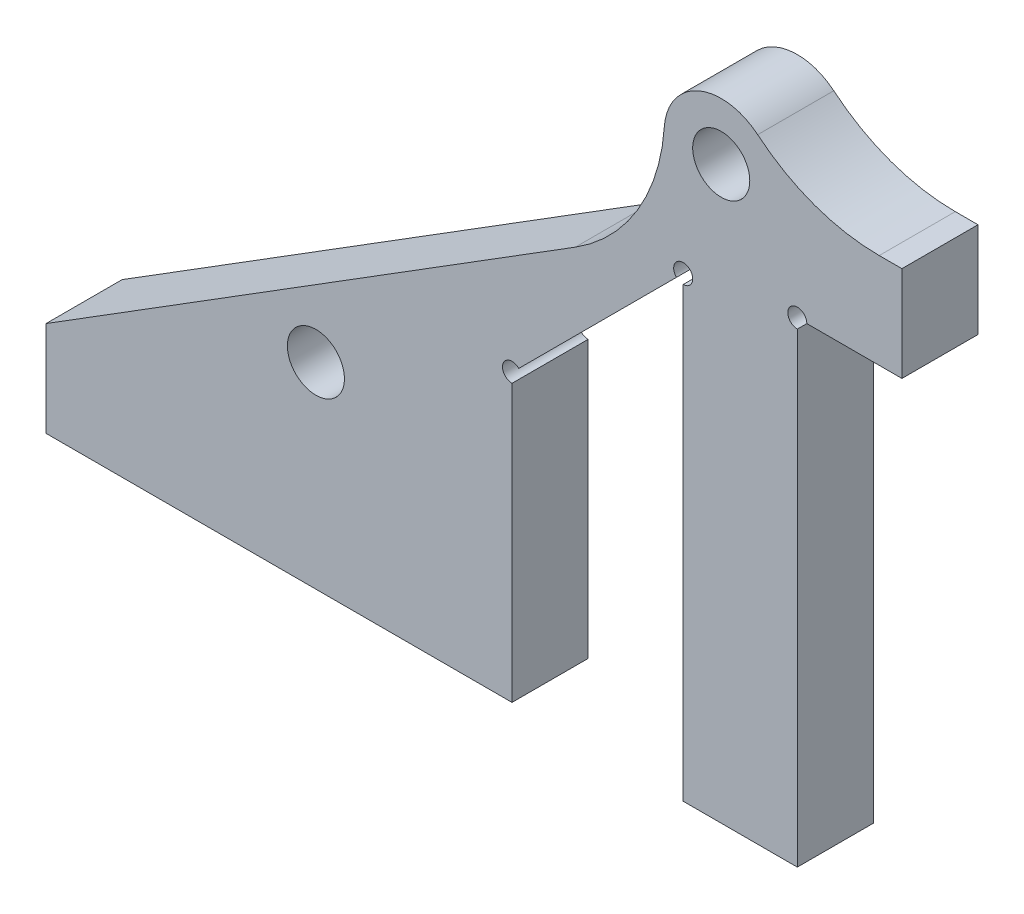
ISO-10303-21;
HEADER;
FILE_DESCRIPTION(('STEP AP214'),'2;1');
FILE_NAME('part.step','',(''),(''),'','','');
FILE_SCHEMA(('AUTOMOTIVE_DESIGN { 1 0 10303 214 1 1 1 1 }'));
ENDSEC;
DATA;
#1=APPLICATION_CONTEXT('core data for automotive mechanical design processes');
#2=APPLICATION_PROTOCOL_DEFINITION('international standard','automotive_design',2000,#1);
#3=PRODUCT_CONTEXT('',#1,'mechanical');
#4=PRODUCT('Part','Part','',(#3));
#5=PRODUCT_RELATED_PRODUCT_CATEGORY('part','',(#4));
#6=PRODUCT_DEFINITION_FORMATION('','',#4);
#7=PRODUCT_DEFINITION_CONTEXT('part definition',#1,'design');
#8=PRODUCT_DEFINITION('design','',#6,#7);
#9=PRODUCT_DEFINITION_SHAPE('','',#8);
#10=(LENGTH_UNIT() NAMED_UNIT(*) SI_UNIT(.MILLI.,.METRE.));
#11=(NAMED_UNIT(*) PLANE_ANGLE_UNIT() SI_UNIT($,.RADIAN.));
#12=(NAMED_UNIT(*) SI_UNIT($,.STERADIAN.) SOLID_ANGLE_UNIT());
#13=UNCERTAINTY_MEASURE_WITH_UNIT(LENGTH_MEASURE(1.E-05),#10,'distance_accuracy_value','');
#14=(GEOMETRIC_REPRESENTATION_CONTEXT(3) GLOBAL_UNCERTAINTY_ASSIGNED_CONTEXT((#13)) GLOBAL_UNIT_ASSIGNED_CONTEXT((#10,
#11,#12)) REPRESENTATION_CONTEXT('',''));
#15=CARTESIAN_POINT('',(0.,0.,0.));
#16=DIRECTION('',(0.,0.,1.));
#17=DIRECTION('',(1.,0.,0.));
#18=AXIS2_PLACEMENT_3D('',#15,#16,#17);
#19=CARTESIAN_POINT('',(-45.,4.99999999999999,4.));
#20=DIRECTION('',(0.52999894000318,-0.847998304005088,0.));
#21=DIRECTION('',(0.847998304005088,0.52999894000318,0.));
#22=AXIS2_PLACEMENT_3D('',#19,#20,#21);
#23=PLANE('',#22);
#24=DIRECTION('',(-0.847998304005088,-0.52999894000318,0.));
#25=VECTOR('',#24,1.);
#26=CARTESIAN_POINT('',(-45.,4.99999999999999,4.));
#27=LINE('',#26,#25);
#28=CARTESIAN_POINT('',(-17.170642509827,22.3933484313581,4.));
#29=VERTEX_POINT('',#28);
#30=CARTESIAN_POINT('',(-45.,4.99999999999999,4.));
#31=VERTEX_POINT('',#30);
#32=EDGE_CURVE('E263',#29,#31,#27,.T.);
#33=ORIENTED_EDGE('',*,*,#32,.F.);
#34=DIRECTION('',(0.,0.,1.));
#35=VECTOR('',#34,1.);
#36=CARTESIAN_POINT('',(-17.170642509827,22.3933484313581,4.));
#37=LINE('',#36,#35);
#38=CARTESIAN_POINT('',(-17.170642509827,22.3933484313581,0.));
#39=VERTEX_POINT('',#38);
#40=EDGE_CURVE('E234',#29,#39,#37,.F.);
#41=ORIENTED_EDGE('',*,*,#40,.T.);
#42=DIRECTION('',(-0.847998304005088,-0.52999894000318,0.));
#43=VECTOR('',#42,1.);
#44=CARTESIAN_POINT('',(-45.,4.99999999999999,0.));
#45=LINE('',#44,#43);
#46=CARTESIAN_POINT('',(-45.,4.99999999999999,0.));
#47=VERTEX_POINT('',#46);
#48=EDGE_CURVE('E199',#39,#47,#45,.T.);
#49=ORIENTED_EDGE('',*,*,#48,.T.);
#50=DIRECTION('',(0.,0.,-1.));
#51=VECTOR('',#50,1.);
#52=CARTESIAN_POINT('',(-45.,4.99999999999999,4.));
#53=LINE('',#52,#51);
#54=EDGE_CURVE('E207',#31,#47,#53,.T.);
#55=ORIENTED_EDGE('',*,*,#54,.F.);
#56=EDGE_LOOP('',(#33,#41,#49,#55));
#57=FACE_BOUND('',#56,.T.);
#58=ADVANCED_FACE('F41',(#57),#23,.F.);
#59=CARTESIAN_POINT('',(-20.5,0.,4.));
#60=DIRECTION('',(0.,1.,0.));
#61=DIRECTION('',(-1.,0.,0.));
#62=AXIS2_PLACEMENT_3D('',#59,#60,#61);
#63=PLANE('',#62);
#64=DIRECTION('',(1.,0.,0.));
#65=VECTOR('',#64,1.);
#66=CARTESIAN_POINT('',(-20.5,0.,0.));
#67=LINE('',#66,#65);
#68=CARTESIAN_POINT('',(-45.,0.,0.));
#69=VERTEX_POINT('',#68);
#70=CARTESIAN_POINT('',(-20.5,0.,0.));
#71=VERTEX_POINT('',#70);
#72=EDGE_CURVE('E184',#69,#71,#67,.T.);
#73=ORIENTED_EDGE('',*,*,#72,.T.);
#74=DIRECTION('',(0.,0.,-1.));
#75=VECTOR('',#74,1.);
#76=CARTESIAN_POINT('',(-20.5,0.,4.));
#77=LINE('',#76,#75);
#78=CARTESIAN_POINT('',(-20.5,0.,4.));
#79=VERTEX_POINT('',#78);
#80=EDGE_CURVE('E223',#79,#71,#77,.T.);
#81=ORIENTED_EDGE('',*,*,#80,.F.);
#82=DIRECTION('',(1.,0.,0.));
#83=VECTOR('',#82,1.);
#84=CARTESIAN_POINT('',(-20.5,0.,4.));
#85=LINE('',#84,#83);
#86=CARTESIAN_POINT('',(-45.,0.,4.));
#87=VERTEX_POINT('',#86);
#88=EDGE_CURVE('E203',#87,#79,#85,.T.);
#89=ORIENTED_EDGE('',*,*,#88,.F.);
#90=DIRECTION('',(0.,0.,-1.));
#91=VECTOR('',#90,1.);
#92=CARTESIAN_POINT('',(-45.,0.,4.));
#93=LINE('',#92,#91);
#94=EDGE_CURVE('E204',#87,#69,#93,.T.);
#95=ORIENTED_EDGE('',*,*,#94,.T.);
#96=EDGE_LOOP('',(#73,#81,#89,#95));
#97=FACE_BOUND('',#96,.T.);
#98=ADVANCED_FACE('F278',(#97),#63,.F.);
#99=CARTESIAN_POINT('',(-20.5,0.,4.));
#100=DIRECTION('',(-1.,0.,0.));
#101=DIRECTION('',(0.,0.,1.));
#102=AXIS2_PLACEMENT_3D('',#99,#100,#101);
#103=PLANE('',#102);
#104=DIRECTION('',(0.,1.,0.));
#105=VECTOR('',#104,1.);
#106=CARTESIAN_POINT('',(-20.5,0.,0.));
#107=LINE('',#106,#105);
#108=CARTESIAN_POINT('',(-20.5,14.5299999999999,0.));
#109=VERTEX_POINT('',#108);
#110=EDGE_CURVE('E180',#71,#109,#107,.T.);
#111=ORIENTED_EDGE('',*,*,#110,.T.);
#112=DIRECTION('',(0.,0.,1.));
#113=VECTOR('',#112,1.);
#114=CARTESIAN_POINT('',(-20.5,14.5299999999999,0.));
#115=LINE('',#114,#113);
#116=CARTESIAN_POINT('',(-20.5,14.5299999999999,4.));
#117=VERTEX_POINT('',#116);
#118=EDGE_CURVE('E56',#109,#117,#115,.T.);
#119=ORIENTED_EDGE('',*,*,#118,.T.);
#120=DIRECTION('',(0.,1.,0.));
#121=VECTOR('',#120,1.);
#122=CARTESIAN_POINT('',(-20.5,0.,4.));
#123=LINE('',#122,#121);
#124=EDGE_CURVE('E284',#79,#117,#123,.T.);
#125=ORIENTED_EDGE('',*,*,#124,.F.);
#126=ORIENTED_EDGE('',*,*,#80,.T.);
#127=EDGE_LOOP('',(#111,#119,#125,#126));
#128=FACE_BOUND('',#127,.T.);
#129=ADVANCED_FACE('F282',(#128),#103,.F.);
#130=CARTESIAN_POINT('',(-20.5,15.0299999999999,4.));
#131=DIRECTION('',(-0.707106781186552,0.707106781186543,0.));
#132=DIRECTION('',(-0.707106781186543,-0.707106781186552,0.));
#133=AXIS2_PLACEMENT_3D('',#130,#131,#132);
#134=PLANE('',#133);
#135=DIRECTION('',(0.707106781186543,0.707106781186552,0.));
#136=VECTOR('',#135,1.);
#137=CARTESIAN_POINT('',(-20.5,15.0299999999999,0.));
#138=LINE('',#137,#136);
#139=CARTESIAN_POINT('',(-20.1464466094067,15.3835533905932,0.));
#140=VERTEX_POINT('',#139);
#141=CARTESIAN_POINT('',(-11.8535533905933,23.6764466094067,0.));
#142=VERTEX_POINT('',#141);
#143=EDGE_CURVE('E170',#140,#142,#138,.T.);
#144=ORIENTED_EDGE('',*,*,#143,.T.);
#145=DIRECTION('',(0.,0.,1.));
#146=VECTOR('',#145,1.);
#147=CARTESIAN_POINT('',(-11.8535533905933,23.6764466094067,0.));
#148=LINE('',#147,#146);
#149=CARTESIAN_POINT('',(-11.8535533905933,23.6764466094067,4.));
#150=VERTEX_POINT('',#149);
#151=EDGE_CURVE('E63',#142,#150,#148,.T.);
#152=ORIENTED_EDGE('',*,*,#151,.T.);
#153=DIRECTION('',(0.707106781186543,0.707106781186552,0.));
#154=VECTOR('',#153,1.);
#155=CARTESIAN_POINT('',(-20.5,15.0299999999999,4.));
#156=LINE('',#155,#154);
#157=CARTESIAN_POINT('',(-20.1464466094067,15.3835533905932,4.));
#158=VERTEX_POINT('',#157);
#159=EDGE_CURVE('E172',#158,#150,#156,.T.);
#160=ORIENTED_EDGE('',*,*,#159,.F.);
#161=DIRECTION('',(0.,0.,1.));
#162=VECTOR('',#161,1.);
#163=CARTESIAN_POINT('',(-20.1464466094067,15.3835533905932,0.));
#164=LINE('',#163,#162);
#165=EDGE_CURVE('E159',#158,#140,#164,.F.);
#166=ORIENTED_EDGE('',*,*,#165,.T.);
#167=EDGE_LOOP('',(#144,#152,#160,#166));
#168=FACE_BOUND('',#167,.T.);
#169=ADVANCED_FACE('F169',(#168),#134,.F.);
#170=CARTESIAN_POINT('',(-11.5,24.03,4.));
#171=DIRECTION('',(1.,0.,0.));
#172=DIRECTION('',(0.,1.,0.));
#173=AXIS2_PLACEMENT_3D('',#170,#171,#172);
#174=PLANE('',#173);
#175=DIRECTION('',(0.,-1.,0.));
#176=VECTOR('',#175,1.);
#177=CARTESIAN_POINT('',(-11.5,24.03,4.));
#178=LINE('',#177,#176);
#179=CARTESIAN_POINT('',(-11.5,23.53,4.));
#180=VERTEX_POINT('',#179);
#181=CARTESIAN_POINT('',(-11.5,0.,4.));
#182=VERTEX_POINT('',#181);
#183=EDGE_CURVE('E291',#180,#182,#178,.T.);
#184=ORIENTED_EDGE('',*,*,#183,.F.);
#185=DIRECTION('',(0.,0.,1.));
#186=VECTOR('',#185,1.);
#187=CARTESIAN_POINT('',(-11.5,23.53,0.));
#188=LINE('',#187,#186);
#189=CARTESIAN_POINT('',(-11.5,23.53,0.));
#190=VERTEX_POINT('',#189);
#191=EDGE_CURVE('E335',#180,#190,#188,.F.);
#192=ORIENTED_EDGE('',*,*,#191,.T.);
#193=DIRECTION('',(0.,-1.,0.));
#194=VECTOR('',#193,1.);
#195=CARTESIAN_POINT('',(-11.5,24.03,0.));
#196=LINE('',#195,#194);
#197=CARTESIAN_POINT('',(-11.5,0.,0.));
#198=VERTEX_POINT('',#197);
#199=EDGE_CURVE('E179',#190,#198,#196,.T.);
#200=ORIENTED_EDGE('',*,*,#199,.T.);
#201=DIRECTION('',(0.,0.,-1.));
#202=VECTOR('',#201,1.);
#203=CARTESIAN_POINT('',(-11.5,0.,4.));
#204=LINE('',#203,#202);
#205=EDGE_CURVE('E220',#182,#198,#204,.T.);
#206=ORIENTED_EDGE('',*,*,#205,.F.);
#207=EDGE_LOOP('',(#184,#192,#200,#206));
#208=FACE_BOUND('',#207,.T.);
#209=ADVANCED_FACE('F358',(#208),#174,.F.);
#210=CARTESIAN_POINT('',(-5.5,0.,4.));
#211=DIRECTION('',(0.,1.,0.));
#212=DIRECTION('',(-1.,0.,0.));
#213=AXIS2_PLACEMENT_3D('',#210,#211,#212);
#214=PLANE('',#213);
#215=DIRECTION('',(1.,0.,0.));
#216=VECTOR('',#215,1.);
#217=CARTESIAN_POINT('',(-5.5,0.,0.));
#218=LINE('',#217,#216);
#219=CARTESIAN_POINT('',(-5.5,0.,0.));
#220=VERTEX_POINT('',#219);
#221=EDGE_CURVE('E182',#198,#220,#218,.T.);
#222=ORIENTED_EDGE('',*,*,#221,.T.);
#223=DIRECTION('',(0.,0.,-1.));
#224=VECTOR('',#223,1.);
#225=CARTESIAN_POINT('',(-5.5,0.,4.));
#226=LINE('',#225,#224);
#227=CARTESIAN_POINT('',(-5.5,0.,4.));
#228=VERTEX_POINT('',#227);
#229=EDGE_CURVE('E217',#228,#220,#226,.T.);
#230=ORIENTED_EDGE('',*,*,#229,.F.);
#231=DIRECTION('',(1.,0.,0.));
#232=VECTOR('',#231,1.);
#233=CARTESIAN_POINT('',(-5.5,0.,4.));
#234=LINE('',#233,#232);
#235=EDGE_CURVE('E293',#182,#228,#234,.T.);
#236=ORIENTED_EDGE('',*,*,#235,.F.);
#237=ORIENTED_EDGE('',*,*,#205,.T.);
#238=EDGE_LOOP('',(#222,#230,#236,#237));
#239=FACE_BOUND('',#238,.T.);
#240=ADVANCED_FACE('F354',(#239),#214,.F.);
#241=CARTESIAN_POINT('',(-5.5,0.,4.));
#242=DIRECTION('',(-1.,0.,0.));
#243=DIRECTION('',(0.,0.,1.));
#244=AXIS2_PLACEMENT_3D('',#241,#242,#243);
#245=PLANE('',#244);
#246=DIRECTION('',(0.,1.,0.));
#247=VECTOR('',#246,1.);
#248=CARTESIAN_POINT('',(-5.5,0.,0.));
#249=LINE('',#248,#247);
#250=CARTESIAN_POINT('',(-5.5,24.5,0.));
#251=VERTEX_POINT('',#250);
#252=EDGE_CURVE('E189',#220,#251,#249,.T.);
#253=ORIENTED_EDGE('',*,*,#252,.T.);
#254=DIRECTION('',(0.,0.,1.));
#255=VECTOR('',#254,1.);
#256=CARTESIAN_POINT('',(-5.5,24.5,0.));
#257=LINE('',#256,#255);
#258=CARTESIAN_POINT('',(-5.5,24.5,4.));
#259=VERTEX_POINT('',#258);
#260=EDGE_CURVE('E326',#251,#259,#257,.T.);
#261=ORIENTED_EDGE('',*,*,#260,.T.);
#262=DIRECTION('',(0.,1.,0.));
#263=VECTOR('',#262,1.);
#264=CARTESIAN_POINT('',(-5.5,0.,4.));
#265=LINE('',#264,#263);
#266=EDGE_CURVE('E295',#228,#259,#265,.T.);
#267=ORIENTED_EDGE('',*,*,#266,.F.);
#268=ORIENTED_EDGE('',*,*,#229,.T.);
#269=EDGE_LOOP('',(#253,#261,#267,#268));
#270=FACE_BOUND('',#269,.T.);
#271=ADVANCED_FACE('F349',(#270),#245,.F.);
#272=CARTESIAN_POINT('',(-5.5,25.,4.));
#273=DIRECTION('',(0.,1.,0.));
#274=DIRECTION('',(0.,0.,1.));
#275=AXIS2_PLACEMENT_3D('',#272,#273,#274);
#276=PLANE('',#275);
#277=DIRECTION('',(1.,0.,0.));
#278=VECTOR('',#277,1.);
#279=CARTESIAN_POINT('',(-5.5,25.,4.));
#280=LINE('',#279,#278);
#281=CARTESIAN_POINT('',(-5.,25.,4.));
#282=VERTEX_POINT('',#281);
#283=CARTESIAN_POINT('',(0.,25.,4.));
#284=VERTEX_POINT('',#283);
#285=EDGE_CURVE('E297',#282,#284,#280,.T.);
#286=ORIENTED_EDGE('',*,*,#285,.F.);
#287=DIRECTION('',(0.,0.,1.));
#288=VECTOR('',#287,1.);
#289=CARTESIAN_POINT('',(-5.,25.,0.));
#290=LINE('',#289,#288);
#291=CARTESIAN_POINT('',(-5.,25.,0.));
#292=VERTEX_POINT('',#291);
#293=EDGE_CURVE('E331',#282,#292,#290,.F.);
#294=ORIENTED_EDGE('',*,*,#293,.T.);
#295=DIRECTION('',(1.,0.,0.));
#296=VECTOR('',#295,1.);
#297=CARTESIAN_POINT('',(-5.5,25.,0.));
#298=LINE('',#297,#296);
#299=CARTESIAN_POINT('',(0.,25.,0.));
#300=VERTEX_POINT('',#299);
#301=EDGE_CURVE('E192',#292,#300,#298,.T.);
#302=ORIENTED_EDGE('',*,*,#301,.T.);
#303=DIRECTION('',(0.,0.,-1.));
#304=VECTOR('',#303,1.);
#305=CARTESIAN_POINT('',(0.,25.,4.));
#306=LINE('',#305,#304);
#307=EDGE_CURVE('E214',#284,#300,#306,.T.);
#308=ORIENTED_EDGE('',*,*,#307,.F.);
#309=EDGE_LOOP('',(#286,#294,#302,#308));
#310=FACE_BOUND('',#309,.T.);
#311=ADVANCED_FACE('F362',(#310),#276,.F.);
#312=CARTESIAN_POINT('',(0.,30.,4.));
#313=DIRECTION('',(-1.,0.,0.));
#314=DIRECTION('',(0.,-1.,0.));
#315=AXIS2_PLACEMENT_3D('',#312,#313,#314);
#316=PLANE('',#315);
#317=DIRECTION('',(0.,1.,0.));
#318=VECTOR('',#317,1.);
#319=CARTESIAN_POINT('',(0.,30.,0.));
#320=LINE('',#319,#318);
#321=CARTESIAN_POINT('',(0.,30.,0.));
#322=VERTEX_POINT('',#321);
#323=EDGE_CURVE('E194',#300,#322,#320,.T.);
#324=ORIENTED_EDGE('',*,*,#323,.T.);
#325=DIRECTION('',(0.,0.,-1.));
#326=VECTOR('',#325,1.);
#327=CARTESIAN_POINT('',(0.,30.,4.));
#328=LINE('',#327,#326);
#329=CARTESIAN_POINT('',(0.,30.,4.));
#330=VERTEX_POINT('',#329);
#331=EDGE_CURVE('E211',#330,#322,#328,.T.);
#332=ORIENTED_EDGE('',*,*,#331,.F.);
#333=DIRECTION('',(0.,1.,0.));
#334=VECTOR('',#333,1.);
#335=CARTESIAN_POINT('',(0.,30.,4.));
#336=LINE('',#335,#334);
#337=EDGE_CURVE('E271',#284,#330,#336,.T.);
#338=ORIENTED_EDGE('',*,*,#337,.F.);
#339=ORIENTED_EDGE('',*,*,#307,.T.);
#340=EDGE_LOOP('',(#324,#332,#338,#339));
#341=FACE_BOUND('',#340,.T.);
#342=ADVANCED_FACE('F305',(#341),#316,.F.);
#343=CARTESIAN_POINT('',(-5.,30.,4.));
#344=DIRECTION('',(0.,-1.,0.));
#345=DIRECTION('',(0.,0.,-1.));
#346=AXIS2_PLACEMENT_3D('',#343,#344,#345);
#347=PLANE('',#346);
#348=DIRECTION('',(-1.,0.,0.));
#349=VECTOR('',#348,1.);
#350=CARTESIAN_POINT('',(-5.,30.,0.));
#351=LINE('',#350,#349);
#352=CARTESIAN_POINT('',(-1.19337613708193,30.,0.));
#353=VERTEX_POINT('',#352);
#354=EDGE_CURVE('E196',#322,#353,#351,.T.);
#355=ORIENTED_EDGE('',*,*,#354,.T.);
#356=DIRECTION('',(0.,0.,1.));
#357=VECTOR('',#356,1.);
#358=CARTESIAN_POINT('',(-1.19337613708193,30.,4.));
#359=LINE('',#358,#357);
#360=CARTESIAN_POINT('',(-1.19337613708193,30.,4.));
#361=VERTEX_POINT('',#360);
#362=EDGE_CURVE('E226',#353,#361,#359,.T.);
#363=ORIENTED_EDGE('',*,*,#362,.T.);
#364=DIRECTION('',(-1.,0.,0.));
#365=VECTOR('',#364,1.);
#366=CARTESIAN_POINT('',(-5.,30.,4.));
#367=LINE('',#366,#365);
#368=EDGE_CURVE('E267',#330,#361,#367,.T.);
#369=ORIENTED_EDGE('',*,*,#368,.F.);
#370=ORIENTED_EDGE('',*,*,#331,.T.);
#371=EDGE_LOOP('',(#355,#363,#369,#370));
#372=FACE_BOUND('',#371,.T.);
#373=ADVANCED_FACE('F309',(#372),#347,.F.);
#374=CARTESIAN_POINT('',(-45.,0.,4.));
#375=DIRECTION('',(1.,0.,0.));
#376=DIRECTION('',(0.,0.,-1.));
#377=AXIS2_PLACEMENT_3D('',#374,#375,#376);
#378=PLANE('',#377);
#379=DIRECTION('',(0.,-1.,0.));
#380=VECTOR('',#379,1.);
#381=CARTESIAN_POINT('',(-45.,0.,0.));
#382=LINE('',#381,#380);
#383=EDGE_CURVE('E201',#47,#69,#382,.T.);
#384=ORIENTED_EDGE('',*,*,#383,.T.);
#385=ORIENTED_EDGE('',*,*,#94,.F.);
#386=DIRECTION('',(0.,-1.,0.));
#387=VECTOR('',#386,1.);
#388=CARTESIAN_POINT('',(-45.,0.,4.));
#389=LINE('',#388,#387);
#390=EDGE_CURVE('E208',#31,#87,#389,.T.);
#391=ORIENTED_EDGE('',*,*,#390,.F.);
#392=ORIENTED_EDGE('',*,*,#54,.T.);
#393=EDGE_LOOP('',(#384,#385,#391,#392));
#394=FACE_BOUND('',#393,.T.);
#395=ADVANCED_FACE('F380',(#394),#378,.F.);
#396=CARTESIAN_POINT('',(0.,0.,4.));
#397=DIRECTION('',(0.,0.,-1.));
#398=DIRECTION('',(-1.,0.,0.));
#399=AXIS2_PLACEMENT_3D('',#396,#397,#398);
#400=PLANE('',#399);
#401=CARTESIAN_POINT('',(-30.8102174986891,10.3308711387981,4.));
#402=DIRECTION('',(0.,0.,1.));
#403=DIRECTION('',(1.,0.,0.));
#404=AXIS2_PLACEMENT_3D('',#401,#402,#403);
#405=CIRCLE('',#404,1.5);
#406=CARTESIAN_POINT('',(-29.3102174986891,10.3308711387981,4.));
#407=VERTEX_POINT('',#406);
#408=EDGE_CURVE('E323',#407,#407,#405,.T.);
#409=ORIENTED_EDGE('',*,*,#408,.F.);
#410=EDGE_LOOP('',(#409));
#411=FACE_BOUND('',#410,.T.);
#412=ORIENTED_EDGE('',*,*,#266,.T.);
#413=CARTESIAN_POINT('',(-5.5,25.,4.));
#414=DIRECTION('',(0.,0.,1.));
#415=DIRECTION('',(1.,0.,0.));
#416=AXIS2_PLACEMENT_3D('',#413,#414,#415);
#417=CIRCLE('',#416,0.500000000000001);
#418=EDGE_CURVE('E342',#282,#259,#417,.T.);
#419=ORIENTED_EDGE('',*,*,#418,.F.);
#420=ORIENTED_EDGE('',*,*,#285,.T.);
#421=ORIENTED_EDGE('',*,*,#337,.T.);
#422=ORIENTED_EDGE('',*,*,#368,.T.);
#423=CARTESIAN_POINT('',(-1.19337613708193,40.,4.));
#424=DIRECTION('',(0.,0.,-1.));
#425=DIRECTION('',(-1.,0.,0.));
#426=AXIS2_PLACEMENT_3D('',#423,#424,#425);
#427=CIRCLE('',#426,10.);
#428=CARTESIAN_POINT('',(-7.58308680086506,32.3076923076923,4.));
#429=VERTEX_POINT('',#428);
#430=EDGE_CURVE('E236',#361,#429,#427,.T.);
#431=ORIENTED_EDGE('',*,*,#430,.T.);
#432=CARTESIAN_POINT('',(-9.5,30.,4.));
#433=DIRECTION('',(0.,0.,1.));
#434=DIRECTION('',(1.,0.,0.));
#435=AXIS2_PLACEMENT_3D('',#432,#433,#434);
#436=CIRCLE('',#435,3.);
#437=CARTESIAN_POINT('',(-12.4932227484289,30.2015380318636,4.));
#438=VERTEX_POINT('',#437);
#439=EDGE_CURVE('E256',#429,#438,#436,.T.);
#440=ORIENTED_EDGE('',*,*,#439,.T.);
#441=CARTESIAN_POINT('',(-22.4706319098588,30.873331471409,4.));
#442=DIRECTION('',(0.,0.,-1.));
#443=DIRECTION('',(-1.,0.,0.));
#444=AXIS2_PLACEMENT_3D('',#441,#442,#443);
#445=CIRCLE('',#444,10.);
#446=EDGE_CURVE('E240',#438,#29,#445,.T.);
#447=ORIENTED_EDGE('',*,*,#446,.T.);
#448=ORIENTED_EDGE('',*,*,#32,.T.);
#449=ORIENTED_EDGE('',*,*,#390,.T.);
#450=ORIENTED_EDGE('',*,*,#88,.T.);
#451=ORIENTED_EDGE('',*,*,#124,.T.);
#452=CARTESIAN_POINT('',(-20.5,15.0299999999999,4.));
#453=DIRECTION('',(0.,0.,1.));
#454=DIRECTION('',(1.,0.,0.));
#455=AXIS2_PLACEMENT_3D('',#452,#453,#454);
#456=CIRCLE('',#455,0.499999999999999);
#457=EDGE_CURVE('E164',#158,#117,#456,.T.);
#458=ORIENTED_EDGE('',*,*,#457,.F.);
#459=ORIENTED_EDGE('',*,*,#159,.T.);
#460=CARTESIAN_POINT('',(-11.5,24.03,4.));
#461=DIRECTION('',(0.,0.,1.));
#462=DIRECTION('',(1.,0.,0.));
#463=AXIS2_PLACEMENT_3D('',#460,#461,#462);
#464=CIRCLE('',#463,0.500000000000001);
#465=EDGE_CURVE('E340',#180,#150,#464,.T.);
#466=ORIENTED_EDGE('',*,*,#465,.F.);
#467=ORIENTED_EDGE('',*,*,#183,.T.);
#468=ORIENTED_EDGE('',*,*,#235,.T.);
#469=EDGE_LOOP('',(#412,#419,#420,#421,#422,#431,#440,#447,#448,#449,#450,#451,#458,#459,#466,
#467,#468));
#470=FACE_BOUND('',#469,.T.);
#471=CARTESIAN_POINT('',(-9.5,30.,4.));
#472=DIRECTION('',(0.,0.,1.));
#473=DIRECTION('',(1.,0.,0.));
#474=AXIS2_PLACEMENT_3D('',#471,#472,#473);
#475=CIRCLE('',#474,1.5);
#476=CARTESIAN_POINT('',(-8.,30.,4.));
#477=VERTEX_POINT('',#476);
#478=EDGE_CURVE('E315',#477,#477,#475,.T.);
#479=ORIENTED_EDGE('',*,*,#478,.F.);
#480=EDGE_LOOP('',(#479));
#481=FACE_BOUND('',#480,.T.);
#482=ADVANCED_FACE('F261',(#411,#470,#481),#400,.F.);
#483=CARTESIAN_POINT('',(0.,0.,0.));
#484=DIRECTION('',(0.,0.,-1.));
#485=DIRECTION('',(-1.,0.,0.));
#486=AXIS2_PLACEMENT_3D('',#483,#484,#485);
#487=PLANE('',#486);
#488=CARTESIAN_POINT('',(-5.5,25.,0.));
#489=DIRECTION('',(0.,0.,1.));
#490=DIRECTION('',(1.,0.,0.));
#491=AXIS2_PLACEMENT_3D('',#488,#489,#490);
#492=CIRCLE('',#491,0.500000000000001);
#493=EDGE_CURVE('E173',#292,#251,#492,.T.);
#494=ORIENTED_EDGE('',*,*,#493,.T.);
#495=ORIENTED_EDGE('',*,*,#252,.F.);
#496=ORIENTED_EDGE('',*,*,#221,.F.);
#497=ORIENTED_EDGE('',*,*,#199,.F.);
#498=CARTESIAN_POINT('',(-11.5,24.03,0.));
#499=DIRECTION('',(0.,0.,-1.));
#500=DIRECTION('',(-1.,0.,0.));
#501=AXIS2_PLACEMENT_3D('',#498,#499,#500);
#502=CIRCLE('',#501,0.500000000000001);
#503=EDGE_CURVE('E11',#142,#190,#502,.T.);
#504=ORIENTED_EDGE('',*,*,#503,.F.);
#505=ORIENTED_EDGE('',*,*,#143,.F.);
#506=CARTESIAN_POINT('',(-20.5,15.0299999999999,0.));
#507=DIRECTION('',(0.,0.,1.));
#508=DIRECTION('',(1.,0.,0.));
#509=AXIS2_PLACEMENT_3D('',#506,#507,#508);
#510=CIRCLE('',#509,0.499999999999999);
#511=EDGE_CURVE('E156',#140,#109,#510,.T.);
#512=ORIENTED_EDGE('',*,*,#511,.T.);
#513=ORIENTED_EDGE('',*,*,#110,.F.);
#514=ORIENTED_EDGE('',*,*,#72,.F.);
#515=ORIENTED_EDGE('',*,*,#383,.F.);
#516=ORIENTED_EDGE('',*,*,#48,.F.);
#517=CARTESIAN_POINT('',(-22.4706319098588,30.873331471409,0.));
#518=DIRECTION('',(0.,0.,-1.));
#519=DIRECTION('',(-1.,0.,0.));
#520=AXIS2_PLACEMENT_3D('',#517,#518,#519);
#521=CIRCLE('',#520,10.);
#522=CARTESIAN_POINT('',(-12.4932227484289,30.2015380318636,0.));
#523=VERTEX_POINT('',#522);
#524=EDGE_CURVE('E49',#39,#523,#521,.F.);
#525=ORIENTED_EDGE('',*,*,#524,.T.);
#526=CARTESIAN_POINT('',(-9.5,30.,0.));
#527=DIRECTION('',(0.,0.,1.));
#528=DIRECTION('',(1.,0.,0.));
#529=AXIS2_PLACEMENT_3D('',#526,#527,#528);
#530=CIRCLE('',#529,3.);
#531=CARTESIAN_POINT('',(-7.58308680086506,32.3076923076923,0.));
#532=VERTEX_POINT('',#531);
#533=EDGE_CURVE('E245',#532,#523,#530,.T.);
#534=ORIENTED_EDGE('',*,*,#533,.F.);
#535=CARTESIAN_POINT('',(-1.19337613708193,40.,0.));
#536=DIRECTION('',(0.,0.,-1.));
#537=DIRECTION('',(-1.,0.,0.));
#538=AXIS2_PLACEMENT_3D('',#535,#536,#537);
#539=CIRCLE('',#538,10.);
#540=EDGE_CURVE('E238',#532,#353,#539,.F.);
#541=ORIENTED_EDGE('',*,*,#540,.T.);
#542=ORIENTED_EDGE('',*,*,#354,.F.);
#543=ORIENTED_EDGE('',*,*,#323,.F.);
#544=ORIENTED_EDGE('',*,*,#301,.F.);
#545=EDGE_LOOP('',(#494,#495,#496,#497,#504,#505,#512,#513,#514,#515,#516,#525,#534,#541,#542,
#543,#544));
#546=FACE_BOUND('',#545,.T.);
#547=CARTESIAN_POINT('',(-30.8102174986891,10.3308711387981,0.));
#548=DIRECTION('',(0.,0.,1.));
#549=DIRECTION('',(1.,0.,0.));
#550=AXIS2_PLACEMENT_3D('',#547,#548,#549);
#551=CIRCLE('',#550,1.5);
#552=CARTESIAN_POINT('',(-29.3102174986891,10.3308711387981,0.));
#553=VERTEX_POINT('',#552);
#554=EDGE_CURVE('E320',#553,#553,#551,.T.);
#555=ORIENTED_EDGE('',*,*,#554,.T.);
#556=EDGE_LOOP('',(#555));
#557=FACE_BOUND('',#556,.T.);
#558=CARTESIAN_POINT('',(-9.5,30.,0.));
#559=DIRECTION('',(0.,0.,1.));
#560=DIRECTION('',(1.,0.,0.));
#561=AXIS2_PLACEMENT_3D('',#558,#559,#560);
#562=CIRCLE('',#561,1.5);
#563=CARTESIAN_POINT('',(-8.,30.,0.));
#564=VERTEX_POINT('',#563);
#565=EDGE_CURVE('E313',#564,#564,#562,.T.);
#566=ORIENTED_EDGE('',*,*,#565,.T.);
#567=EDGE_LOOP('',(#566));
#568=FACE_BOUND('',#567,.T.);
#569=ADVANCED_FACE('F176',(#546,#557,#568),#487,.T.);
#570=CARTESIAN_POINT('',(-9.5,30.,0.));
#571=DIRECTION('',(0.,0.,1.));
#572=DIRECTION('',(1.,0.,0.));
#573=AXIS2_PLACEMENT_3D('',#570,#571,#572);
#574=CYLINDRICAL_SURFACE('',#573,3.);
#575=ORIENTED_EDGE('',*,*,#439,.F.);
#576=DIRECTION('',(0.,0.,1.));
#577=VECTOR('',#576,1.);
#578=CARTESIAN_POINT('',(-7.58308680086506,32.3076923076923,0.));
#579=LINE('',#578,#577);
#580=EDGE_CURVE('E232',#429,#532,#579,.F.);
#581=ORIENTED_EDGE('',*,*,#580,.T.);
#582=ORIENTED_EDGE('',*,*,#533,.T.);
#583=DIRECTION('',(0.,0.,1.));
#584=VECTOR('',#583,1.);
#585=CARTESIAN_POINT('',(-12.4932227484289,30.2015380318636,0.));
#586=LINE('',#585,#584);
#587=EDGE_CURVE('E229',#523,#438,#586,.T.);
#588=ORIENTED_EDGE('',*,*,#587,.T.);
#589=EDGE_LOOP('',(#575,#581,#582,#588));
#590=FACE_BOUND('',#589,.T.);
#591=ADVANCED_FACE('F253',(#590),#574,.T.);
#592=CARTESIAN_POINT('',(-9.5,30.,0.));
#593=DIRECTION('',(0.,0.,1.));
#594=DIRECTION('',(1.,0.,0.));
#595=AXIS2_PLACEMENT_3D('',#592,#593,#594);
#596=CYLINDRICAL_SURFACE('',#595,1.5);
#597=ORIENTED_EDGE('',*,*,#565,.F.);
#598=EDGE_LOOP('',(#597));
#599=FACE_BOUND('',#598,.T.);
#600=ORIENTED_EDGE('',*,*,#478,.T.);
#601=EDGE_LOOP('',(#600));
#602=FACE_BOUND('',#601,.T.);
#603=ADVANCED_FACE('F402',(#599,#602),#596,.F.);
#604=CARTESIAN_POINT('',(-30.8102174986891,10.3308711387981,0.));
#605=DIRECTION('',(0.,0.,1.));
#606=DIRECTION('',(1.,0.,0.));
#607=AXIS2_PLACEMENT_3D('',#604,#605,#606);
#608=CYLINDRICAL_SURFACE('',#607,1.5);
#609=ORIENTED_EDGE('',*,*,#554,.F.);
#610=EDGE_LOOP('',(#609));
#611=FACE_BOUND('',#610,.T.);
#612=ORIENTED_EDGE('',*,*,#408,.T.);
#613=EDGE_LOOP('',(#612));
#614=FACE_BOUND('',#613,.T.);
#615=ADVANCED_FACE('F397',(#611,#614),#608,.F.);
#616=CARTESIAN_POINT('',(-1.19337613708193,40.,0.));
#617=DIRECTION('',(0.,0.,1.));
#618=DIRECTION('',(1.,0.,0.));
#619=AXIS2_PLACEMENT_3D('',#616,#617,#618);
#620=CYLINDRICAL_SURFACE('',#619,10.);
#621=ORIENTED_EDGE('',*,*,#540,.F.);
#622=ORIENTED_EDGE('',*,*,#580,.F.);
#623=ORIENTED_EDGE('',*,*,#430,.F.);
#624=ORIENTED_EDGE('',*,*,#362,.F.);
#625=EDGE_LOOP('',(#621,#622,#623,#624));
#626=FACE_BOUND('',#625,.T.);
#627=ADVANCED_FACE('F312',(#626),#620,.F.);
#628=CARTESIAN_POINT('',(-22.4706319098588,30.873331471409,0.));
#629=DIRECTION('',(0.,0.,1.));
#630=DIRECTION('',(1.,0.,0.));
#631=AXIS2_PLACEMENT_3D('',#628,#629,#630);
#632=CYLINDRICAL_SURFACE('',#631,10.);
#633=ORIENTED_EDGE('',*,*,#524,.F.);
#634=ORIENTED_EDGE('',*,*,#40,.F.);
#635=ORIENTED_EDGE('',*,*,#446,.F.);
#636=ORIENTED_EDGE('',*,*,#587,.F.);
#637=EDGE_LOOP('',(#633,#634,#635,#636));
#638=FACE_BOUND('',#637,.T.);
#639=ADVANCED_FACE('F43',(#638),#632,.F.);
#640=CARTESIAN_POINT('',(-20.5,15.0299999999999,0.));
#641=DIRECTION('',(0.,0.,1.));
#642=DIRECTION('',(1.,0.,0.));
#643=AXIS2_PLACEMENT_3D('',#640,#641,#642);
#644=CYLINDRICAL_SURFACE('',#643,0.499999999999999);
#645=ORIENTED_EDGE('',*,*,#511,.F.);
#646=ORIENTED_EDGE('',*,*,#165,.F.);
#647=ORIENTED_EDGE('',*,*,#457,.T.);
#648=ORIENTED_EDGE('',*,*,#118,.F.);
#649=EDGE_LOOP('',(#645,#646,#647,#648));
#650=FACE_BOUND('',#649,.T.);
#651=ADVANCED_FACE('F158',(#650),#644,.F.);
#652=CARTESIAN_POINT('',(-11.5,24.03,0.));
#653=DIRECTION('',(0.,0.,1.));
#654=DIRECTION('',(1.,0.,0.));
#655=AXIS2_PLACEMENT_3D('',#652,#653,#654);
#656=CYLINDRICAL_SURFACE('',#655,0.500000000000001);
#657=ORIENTED_EDGE('',*,*,#503,.T.);
#658=ORIENTED_EDGE('',*,*,#191,.F.);
#659=ORIENTED_EDGE('',*,*,#465,.T.);
#660=ORIENTED_EDGE('',*,*,#151,.F.);
#661=EDGE_LOOP('',(#657,#658,#659,#660));
#662=FACE_BOUND('',#661,.T.);
#663=ADVANCED_FACE('F360',(#662),#656,.F.);
#664=CARTESIAN_POINT('',(-5.5,25.,0.));
#665=DIRECTION('',(0.,0.,1.));
#666=DIRECTION('',(1.,0.,0.));
#667=AXIS2_PLACEMENT_3D('',#664,#665,#666);
#668=CYLINDRICAL_SURFACE('',#667,0.500000000000001);
#669=ORIENTED_EDGE('',*,*,#493,.F.);
#670=ORIENTED_EDGE('',*,*,#293,.F.);
#671=ORIENTED_EDGE('',*,*,#418,.T.);
#672=ORIENTED_EDGE('',*,*,#260,.F.);
#673=EDGE_LOOP('',(#669,#670,#671,#672));
#674=FACE_BOUND('',#673,.T.);
#675=ADVANCED_FACE('F363',(#674),#668,.F.);
#676=CLOSED_SHELL('',(#58,#98,#129,#169,#209,#240,#271,#311,#342,#373,#395,#482,#569,#591,#603,
#615,#627,#639,#651,#663,#675));
#677=MANIFOLD_SOLID_BREP('B2',#676);
#678=ADVANCED_BREP_SHAPE_REPRESENTATION('',(#18,#677),#14);
#679=SHAPE_DEFINITION_REPRESENTATION(#9,#678);
ENDSEC;
END-ISO-10303-21;
